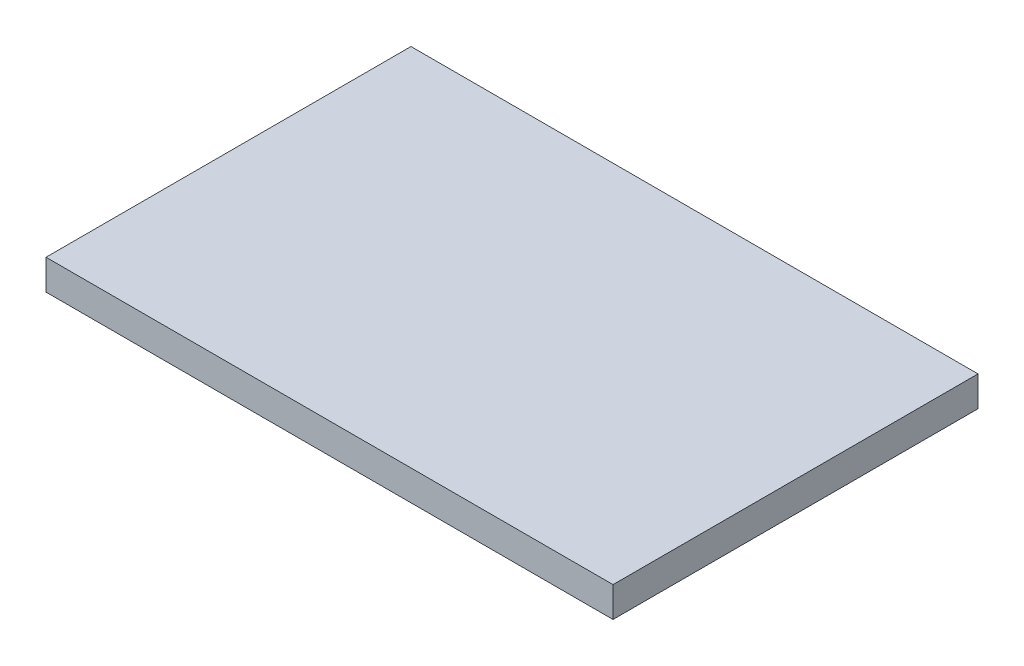
ISO-10303-21;
HEADER;
FILE_DESCRIPTION(('STEP AP214'),'2;1');
FILE_NAME('part.step','',(''),(''),'','','');
FILE_SCHEMA(('AUTOMOTIVE_DESIGN { 1 0 10303 214 1 1 1 1 }'));
ENDSEC;
DATA;
#1=APPLICATION_CONTEXT('core data for automotive mechanical design processes');
#2=APPLICATION_PROTOCOL_DEFINITION('international standard','automotive_design',2000,#1);
#3=PRODUCT_CONTEXT('',#1,'mechanical');
#4=PRODUCT('Part','Part','',(#3));
#5=PRODUCT_RELATED_PRODUCT_CATEGORY('part','',(#4));
#6=PRODUCT_DEFINITION_FORMATION('','',#4);
#7=PRODUCT_DEFINITION_CONTEXT('part definition',#1,'design');
#8=PRODUCT_DEFINITION('design','',#6,#7);
#9=PRODUCT_DEFINITION_SHAPE('','',#8);
#10=(LENGTH_UNIT() NAMED_UNIT(*) SI_UNIT(.MILLI.,.METRE.));
#11=(NAMED_UNIT(*) PLANE_ANGLE_UNIT() SI_UNIT($,.RADIAN.));
#12=(NAMED_UNIT(*) SI_UNIT($,.STERADIAN.) SOLID_ANGLE_UNIT());
#13=UNCERTAINTY_MEASURE_WITH_UNIT(LENGTH_MEASURE(1.E-05),#10,'distance_accuracy_value','');
#14=(GEOMETRIC_REPRESENTATION_CONTEXT(3) GLOBAL_UNCERTAINTY_ASSIGNED_CONTEXT((#13)) GLOBAL_UNIT_ASSIGNED_CONTEXT((#10,
#11,#12)) REPRESENTATION_CONTEXT('',''));
#15=CARTESIAN_POINT('',(0.,0.,0.));
#16=DIRECTION('',(0.,0.,1.));
#17=DIRECTION('',(1.,0.,0.));
#18=AXIS2_PLACEMENT_3D('',#15,#16,#17);
#19=CARTESIAN_POINT('',(23.8375130259876,2.54,15.3433661119129));
#20=DIRECTION('',(-1.,0.,0.));
#21=DIRECTION('',(0.,0.,1.));
#22=AXIS2_PLACEMENT_3D('',#19,#20,#21);
#23=PLANE('',#22);
#24=DIRECTION('',(0.,0.,-1.));
#25=VECTOR('',#24,1.);
#26=CARTESIAN_POINT('',(23.8375130259876,0.,15.3433661119129));
#27=LINE('',#26,#25);
#28=CARTESIAN_POINT('',(23.8375130259876,0.,15.3433661119129));
#29=VERTEX_POINT('',#28);
#30=CARTESIAN_POINT('',(23.8375130259876,0.,-15.3433661119129));
#31=VERTEX_POINT('',#30);
#32=EDGE_CURVE('E102',#29,#31,#27,.T.);
#33=ORIENTED_EDGE('',*,*,#32,.T.);
#34=DIRECTION('',(0.,-1.,0.));
#35=VECTOR('',#34,1.);
#36=CARTESIAN_POINT('',(23.8375130259876,2.54,-15.3433661119129));
#37=LINE('',#36,#35);
#38=CARTESIAN_POINT('',(23.8375130259876,2.54,-15.3433661119129));
#39=VERTEX_POINT('',#38);
#40=EDGE_CURVE('E11',#39,#31,#37,.T.);
#41=ORIENTED_EDGE('',*,*,#40,.F.);
#42=DIRECTION('',(0.,0.,-1.));
#43=VECTOR('',#42,1.);
#44=CARTESIAN_POINT('',(23.8375130259876,2.54,15.3433661119129));
#45=LINE('',#44,#43);
#46=CARTESIAN_POINT('',(23.8375130259876,2.54,15.3433661119129));
#47=VERTEX_POINT('',#46);
#48=EDGE_CURVE('E90',#47,#39,#45,.T.);
#49=ORIENTED_EDGE('',*,*,#48,.F.);
#50=DIRECTION('',(0.,-1.,0.));
#51=VECTOR('',#50,1.);
#52=CARTESIAN_POINT('',(23.8375130259876,2.54,15.3433661119129));
#53=LINE('',#52,#51);
#54=EDGE_CURVE('E98',#47,#29,#53,.T.);
#55=ORIENTED_EDGE('',*,*,#54,.T.);
#56=EDGE_LOOP('',(#33,#41,#49,#55));
#57=FACE_BOUND('',#56,.T.);
#58=ADVANCED_FACE('F39',(#57),#23,.F.);
#59=CARTESIAN_POINT('',(-23.8375130259876,2.54,-15.3433661119129));
#60=DIRECTION('',(0.,0.,1.));
#61=DIRECTION('',(1.,0.,0.));
#62=AXIS2_PLACEMENT_3D('',#59,#60,#61);
#63=PLANE('',#62);
#64=DIRECTION('',(-1.,0.,0.));
#65=VECTOR('',#64,1.);
#66=CARTESIAN_POINT('',(-23.8375130259876,0.,-15.3433661119129));
#67=LINE('',#66,#65);
#68=CARTESIAN_POINT('',(-23.8375130259876,0.,-15.3433661119129));
#69=VERTEX_POINT('',#68);
#70=EDGE_CURVE('E94',#31,#69,#67,.T.);
#71=ORIENTED_EDGE('',*,*,#70,.T.);
#72=DIRECTION('',(0.,-1.,0.));
#73=VECTOR('',#72,1.);
#74=CARTESIAN_POINT('',(-23.8375130259876,2.54,-15.3433661119129));
#75=LINE('',#74,#73);
#76=CARTESIAN_POINT('',(-23.8375130259876,2.54,-15.3433661119129));
#77=VERTEX_POINT('',#76);
#78=EDGE_CURVE('E47',#77,#69,#75,.T.);
#79=ORIENTED_EDGE('',*,*,#78,.F.);
#80=DIRECTION('',(-1.,0.,0.));
#81=VECTOR('',#80,1.);
#82=CARTESIAN_POINT('',(-23.8375130259876,2.54,-15.3433661119129));
#83=LINE('',#82,#81);
#84=EDGE_CURVE('E85',#39,#77,#83,.T.);
#85=ORIENTED_EDGE('',*,*,#84,.F.);
#86=ORIENTED_EDGE('',*,*,#40,.T.);
#87=EDGE_LOOP('',(#71,#79,#85,#86));
#88=FACE_BOUND('',#87,.T.);
#89=ADVANCED_FACE('F93',(#88),#63,.F.);
#90=CARTESIAN_POINT('',(-23.8375130259876,2.54,15.3433661119129));
#91=DIRECTION('',(1.,0.,0.));
#92=DIRECTION('',(0.,0.,-1.));
#93=AXIS2_PLACEMENT_3D('',#90,#91,#92);
#94=PLANE('',#93);
#95=DIRECTION('',(0.,0.,1.));
#96=VECTOR('',#95,1.);
#97=CARTESIAN_POINT('',(-23.8375130259876,0.,15.3433661119129));
#98=LINE('',#97,#96);
#99=CARTESIAN_POINT('',(-23.8375130259876,0.,15.3433661119129));
#100=VERTEX_POINT('',#99);
#101=EDGE_CURVE('E72',#69,#100,#98,.T.);
#102=ORIENTED_EDGE('',*,*,#101,.T.);
#103=DIRECTION('',(0.,-1.,0.));
#104=VECTOR('',#103,1.);
#105=CARTESIAN_POINT('',(-23.8375130259876,2.54,15.3433661119129));
#106=LINE('',#105,#104);
#107=CARTESIAN_POINT('',(-23.8375130259876,2.54,15.3433661119129));
#108=VERTEX_POINT('',#107);
#109=EDGE_CURVE('E95',#108,#100,#106,.T.);
#110=ORIENTED_EDGE('',*,*,#109,.F.);
#111=DIRECTION('',(0.,0.,1.));
#112=VECTOR('',#111,1.);
#113=CARTESIAN_POINT('',(-23.8375130259876,2.54,15.3433661119129));
#114=LINE('',#113,#112);
#115=EDGE_CURVE('E88',#77,#108,#114,.T.);
#116=ORIENTED_EDGE('',*,*,#115,.F.);
#117=ORIENTED_EDGE('',*,*,#78,.T.);
#118=EDGE_LOOP('',(#102,#110,#116,#117));
#119=FACE_BOUND('',#118,.T.);
#120=ADVANCED_FACE('F96',(#119),#94,.F.);
#121=CARTESIAN_POINT('',(-23.8375130259876,2.54,15.3433661119129));
#122=DIRECTION('',(0.,0.,-1.));
#123=DIRECTION('',(-1.,0.,0.));
#124=AXIS2_PLACEMENT_3D('',#121,#122,#123);
#125=PLANE('',#124);
#126=DIRECTION('',(1.,0.,0.));
#127=VECTOR('',#126,1.);
#128=CARTESIAN_POINT('',(-23.8375130259876,0.,15.3433661119129));
#129=LINE('',#128,#127);
#130=EDGE_CURVE('E78',#100,#29,#129,.T.);
#131=ORIENTED_EDGE('',*,*,#130,.T.);
#132=ORIENTED_EDGE('',*,*,#54,.F.);
#133=DIRECTION('',(1.,0.,0.));
#134=VECTOR('',#133,1.);
#135=CARTESIAN_POINT('',(-23.8375130259876,2.54,15.3433661119129));
#136=LINE('',#135,#134);
#137=EDGE_CURVE('E55',#108,#47,#136,.T.);
#138=ORIENTED_EDGE('',*,*,#137,.F.);
#139=ORIENTED_EDGE('',*,*,#109,.T.);
#140=EDGE_LOOP('',(#131,#132,#138,#139));
#141=FACE_BOUND('',#140,.T.);
#142=ADVANCED_FACE('F109',(#141),#125,.F.);
#143=CARTESIAN_POINT('',(0.,2.54,0.));
#144=DIRECTION('',(0.,-1.,0.));
#145=DIRECTION('',(0.,0.,-1.));
#146=AXIS2_PLACEMENT_3D('',#143,#144,#145);
#147=PLANE('',#146);
#148=ORIENTED_EDGE('',*,*,#48,.T.);
#149=ORIENTED_EDGE('',*,*,#84,.T.);
#150=ORIENTED_EDGE('',*,*,#115,.T.);
#151=ORIENTED_EDGE('',*,*,#137,.T.);
#152=EDGE_LOOP('',(#148,#149,#150,#151));
#153=FACE_BOUND('',#152,.T.);
#154=ADVANCED_FACE('F86',(#153),#147,.F.);
#155=CARTESIAN_POINT('',(0.,0.,0.));
#156=DIRECTION('',(0.,-1.,0.));
#157=DIRECTION('',(0.,0.,-1.));
#158=AXIS2_PLACEMENT_3D('',#155,#156,#157);
#159=PLANE('',#158);
#160=ORIENTED_EDGE('',*,*,#32,.F.);
#161=ORIENTED_EDGE('',*,*,#130,.F.);
#162=ORIENTED_EDGE('',*,*,#101,.F.);
#163=ORIENTED_EDGE('',*,*,#70,.F.);
#164=EDGE_LOOP('',(#160,#161,#162,#163));
#165=FACE_BOUND('',#164,.T.);
#166=ADVANCED_FACE('F112',(#165),#159,.T.);
#167=CLOSED_SHELL('',(#58,#89,#120,#142,#154,#166));
#168=MANIFOLD_SOLID_BREP('B2',#167);
#169=ADVANCED_BREP_SHAPE_REPRESENTATION('',(#18,#168),#14);
#170=SHAPE_DEFINITION_REPRESENTATION(#9,#169);
ENDSEC;
END-ISO-10303-21;
